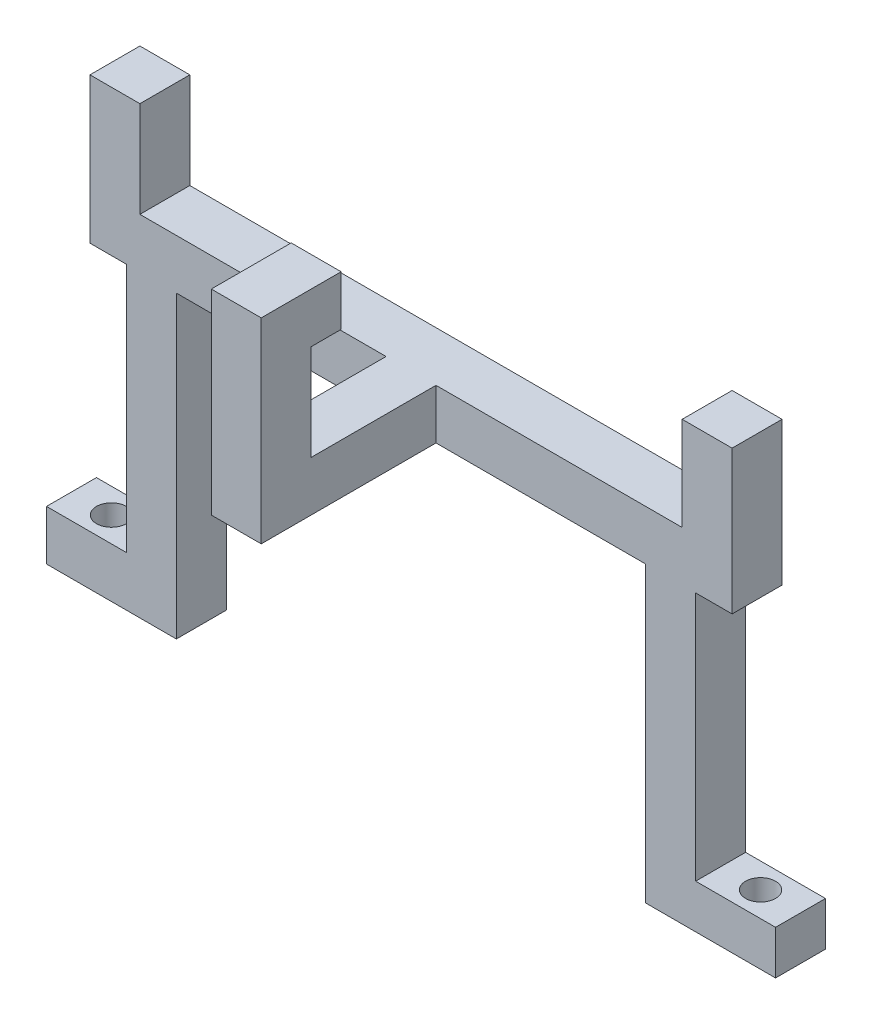
ISO-10303-21;
HEADER;
FILE_DESCRIPTION(('STEP AP214'),'2;1');
FILE_NAME('part.step','',(''),(''),'','','');
FILE_SCHEMA(('AUTOMOTIVE_DESIGN { 1 0 10303 214 1 1 1 1 }'));
ENDSEC;
DATA;
#1=APPLICATION_CONTEXT('core data for automotive mechanical design processes');
#2=APPLICATION_PROTOCOL_DEFINITION('international standard','automotive_design',2000,#1);
#3=PRODUCT_CONTEXT('',#1,'mechanical');
#4=PRODUCT('Part','Part','',(#3));
#5=PRODUCT_RELATED_PRODUCT_CATEGORY('part','',(#4));
#6=PRODUCT_DEFINITION_FORMATION('','',#4);
#7=PRODUCT_DEFINITION_CONTEXT('part definition',#1,'design');
#8=PRODUCT_DEFINITION('design','',#6,#7);
#9=PRODUCT_DEFINITION_SHAPE('','',#8);
#10=(LENGTH_UNIT() NAMED_UNIT(*) SI_UNIT(.MILLI.,.METRE.));
#11=(NAMED_UNIT(*) PLANE_ANGLE_UNIT() SI_UNIT($,.RADIAN.));
#12=(NAMED_UNIT(*) SI_UNIT($,.STERADIAN.) SOLID_ANGLE_UNIT());
#13=UNCERTAINTY_MEASURE_WITH_UNIT(LENGTH_MEASURE(1.E-05),#10,'distance_accuracy_value','');
#14=(GEOMETRIC_REPRESENTATION_CONTEXT(3) GLOBAL_UNCERTAINTY_ASSIGNED_CONTEXT((#13)) GLOBAL_UNIT_ASSIGNED_CONTEXT((#10,
#11,#12)) REPRESENTATION_CONTEXT('',''));
#15=CARTESIAN_POINT('',(0.,0.,0.));
#16=DIRECTION('',(0.,0.,1.));
#17=DIRECTION('',(1.,0.,0.));
#18=AXIS2_PLACEMENT_3D('',#15,#16,#17);
#19=CARTESIAN_POINT('',(0.,0.,5.));
#20=DIRECTION('',(0.,0.,1.));
#21=DIRECTION('',(1.,0.,0.));
#22=AXIS2_PLACEMENT_3D('',#19,#20,#21);
#23=PLANE('',#22);
#24=DIRECTION('',(0.,-1.,0.));
#25=VECTOR('',#24,1.);
#26=CARTESIAN_POINT('',(26.,25.,5.));
#27=LINE('',#26,#25);
#28=CARTESIAN_POINT('',(26.,30.,5.));
#29=VERTEX_POINT('',#28);
#30=CARTESIAN_POINT('',(26.,25.,5.));
#31=VERTEX_POINT('',#30);
#32=EDGE_CURVE('E56',#29,#31,#27,.T.);
#33=ORIENTED_EDGE('',*,*,#32,.F.);
#34=DIRECTION('',(-1.,0.,0.));
#35=VECTOR('',#34,1.);
#36=CARTESIAN_POINT('',(1.35,30.,5.));
#37=LINE('',#36,#35);
#38=CARTESIAN_POINT('',(1.35,30.,5.));
#39=VERTEX_POINT('',#38);
#40=EDGE_CURVE('E402',#29,#39,#37,.T.);
#41=ORIENTED_EDGE('',*,*,#40,.T.);
#42=DIRECTION('',(0.,1.,0.));
#43=VECTOR('',#42,1.);
#44=CARTESIAN_POINT('',(1.35,39.6,5.));
#45=LINE('',#44,#43);
#46=CARTESIAN_POINT('',(1.35,39.6,5.));
#47=VERTEX_POINT('',#46);
#48=EDGE_CURVE('E405',#39,#47,#45,.T.);
#49=ORIENTED_EDGE('',*,*,#48,.T.);
#50=DIRECTION('',(-1.,0.,0.));
#51=VECTOR('',#50,1.);
#52=CARTESIAN_POINT('',(-3.65,39.6,5.));
#53=LINE('',#52,#51);
#54=CARTESIAN_POINT('',(-3.65,39.6,5.));
#55=VERTEX_POINT('',#54);
#56=EDGE_CURVE('E407',#47,#55,#53,.T.);
#57=ORIENTED_EDGE('',*,*,#56,.T.);
#58=DIRECTION('',(0.,-1.,0.));
#59=VECTOR('',#58,1.);
#60=CARTESIAN_POINT('',(-3.65,25.,5.));
#61=LINE('',#60,#59);
#62=CARTESIAN_POINT('',(-3.65,25.,5.));
#63=VERTEX_POINT('',#62);
#64=EDGE_CURVE('E409',#55,#63,#61,.T.);
#65=ORIENTED_EDGE('',*,*,#64,.T.);
#66=DIRECTION('',(1.,0.,0.));
#67=VECTOR('',#66,1.);
#68=CARTESIAN_POINT('',(0.,25.,5.));
#69=LINE('',#68,#67);
#70=CARTESIAN_POINT('',(0.,25.,5.));
#71=VERTEX_POINT('',#70);
#72=EDGE_CURVE('E411',#63,#71,#69,.T.);
#73=ORIENTED_EDGE('',*,*,#72,.T.);
#74=DIRECTION('',(0.,-1.,0.));
#75=VECTOR('',#74,1.);
#76=CARTESIAN_POINT('',(0.,0.,5.));
#77=LINE('',#76,#75);
#78=CARTESIAN_POINT('',(0.,0.,5.));
#79=VERTEX_POINT('',#78);
#80=EDGE_CURVE('E413',#71,#79,#77,.T.);
#81=ORIENTED_EDGE('',*,*,#80,.T.);
#82=DIRECTION('',(-1.,0.,0.));
#83=VECTOR('',#82,1.);
#84=CARTESIAN_POINT('',(-8.,0.,5.));
#85=LINE('',#84,#83);
#86=CARTESIAN_POINT('',(-8.,0.,5.));
#87=VERTEX_POINT('',#86);
#88=EDGE_CURVE('E392',#79,#87,#85,.T.);
#89=ORIENTED_EDGE('',*,*,#88,.T.);
#90=DIRECTION('',(0.,-1.,0.));
#91=VECTOR('',#90,1.);
#92=CARTESIAN_POINT('',(-8.,-5.,5.));
#93=LINE('',#92,#91);
#94=CARTESIAN_POINT('',(-8.,-5.,5.));
#95=VERTEX_POINT('',#94);
#96=EDGE_CURVE('E395',#87,#95,#93,.T.);
#97=ORIENTED_EDGE('',*,*,#96,.T.);
#98=DIRECTION('',(1.,0.,0.));
#99=VECTOR('',#98,1.);
#100=CARTESIAN_POINT('',(5.00000000000001,-5.,5.));
#101=LINE('',#100,#99);
#102=CARTESIAN_POINT('',(5.00000000000001,-5.,5.));
#103=VERTEX_POINT('',#102);
#104=EDGE_CURVE('E398',#95,#103,#101,.T.);
#105=ORIENTED_EDGE('',*,*,#104,.T.);
#106=DIRECTION('',(0.,1.,0.));
#107=VECTOR('',#106,1.);
#108=CARTESIAN_POINT('',(5.,30.,5.));
#109=LINE('',#108,#107);
#110=CARTESIAN_POINT('',(5.,25.,5.));
#111=VERTEX_POINT('',#110);
#112=EDGE_CURVE('E400',#103,#111,#109,.T.);
#113=ORIENTED_EDGE('',*,*,#112,.T.);
#114=DIRECTION('',(-1.,0.,0.));
#115=VECTOR('',#114,1.);
#116=CARTESIAN_POINT('',(52.,25.,5.));
#117=LINE('',#116,#115);
#118=EDGE_CURVE('E61',#31,#111,#117,.T.);
#119=ORIENTED_EDGE('',*,*,#118,.F.);
#120=EDGE_LOOP('',(#33,#41,#49,#57,#65,#73,#81,#89,#97,#105,#113,#119));
#121=FACE_BOUND('',#120,.T.);
#122=ADVANCED_FACE('F41',(#121),#23,.T.);
#123=CARTESIAN_POINT('',(5.,30.,5.));
#124=DIRECTION('',(-1.,0.,0.));
#125=DIRECTION('',(0.,-1.,0.));
#126=AXIS2_PLACEMENT_3D('',#123,#124,#125);
#127=PLANE('',#126);
#128=DIRECTION('',(0.,0.,-1.));
#129=VECTOR('',#128,1.);
#130=CARTESIAN_POINT('',(5.,25.,5.));
#131=LINE('',#130,#129);
#132=CARTESIAN_POINT('',(5.,25.,0.));
#133=VERTEX_POINT('',#132);
#134=EDGE_CURVE('E357',#111,#133,#131,.T.);
#135=ORIENTED_EDGE('',*,*,#134,.F.);
#136=ORIENTED_EDGE('',*,*,#112,.F.);
#137=DIRECTION('',(0.,0.,-1.));
#138=VECTOR('',#137,1.);
#139=CARTESIAN_POINT('',(5.00000000000001,-5.,5.));
#140=LINE('',#139,#138);
#141=CARTESIAN_POINT('',(5.00000000000001,-5.,0.));
#142=VERTEX_POINT('',#141);
#143=EDGE_CURVE('E452',#103,#142,#140,.T.);
#144=ORIENTED_EDGE('',*,*,#143,.T.);
#145=DIRECTION('',(0.,1.,0.));
#146=VECTOR('',#145,1.);
#147=CARTESIAN_POINT('',(5.,30.,0.));
#148=LINE('',#147,#146);
#149=EDGE_CURVE('E422',#142,#133,#148,.T.);
#150=ORIENTED_EDGE('',*,*,#149,.T.);
#151=EDGE_LOOP('',(#135,#136,#144,#150));
#152=FACE_BOUND('',#151,.T.);
#153=ADVANCED_FACE('F468',(#152),#127,.F.);
#154=CARTESIAN_POINT('',(-8.,0.,5.));
#155=DIRECTION('',(0.,-1.,0.));
#156=DIRECTION('',(0.,0.,-1.));
#157=AXIS2_PLACEMENT_3D('',#154,#155,#156);
#158=PLANE('',#157);
#159=CARTESIAN_POINT('',(-4.,0.,2.5));
#160=DIRECTION('',(0.,1.,0.));
#161=DIRECTION('',(0.,0.,1.));
#162=AXIS2_PLACEMENT_3D('',#159,#160,#161);
#163=CIRCLE('',#162,1.5);
#164=CARTESIAN_POINT('',(-4.,0.,4.));
#165=VERTEX_POINT('',#164);
#166=EDGE_CURVE('E385',#165,#165,#163,.T.);
#167=ORIENTED_EDGE('',*,*,#166,.F.);
#168=EDGE_LOOP('',(#167));
#169=FACE_BOUND('',#168,.T.);
#170=DIRECTION('',(-1.,0.,0.));
#171=VECTOR('',#170,1.);
#172=CARTESIAN_POINT('',(-8.,0.,0.));
#173=LINE('',#172,#171);
#174=CARTESIAN_POINT('',(0.,0.,0.));
#175=VERTEX_POINT('',#174);
#176=CARTESIAN_POINT('',(-8.,0.,0.));
#177=VERTEX_POINT('',#176);
#178=EDGE_CURVE('E389',#175,#177,#173,.T.);
#179=ORIENTED_EDGE('',*,*,#178,.T.);
#180=DIRECTION('',(0.,0.,-1.));
#181=VECTOR('',#180,1.);
#182=CARTESIAN_POINT('',(-8.,0.,5.));
#183=LINE('',#182,#181);
#184=EDGE_CURVE('E11',#87,#177,#183,.T.);
#185=ORIENTED_EDGE('',*,*,#184,.F.);
#186=ORIENTED_EDGE('',*,*,#88,.F.);
#187=DIRECTION('',(0.,0.,-1.));
#188=VECTOR('',#187,1.);
#189=CARTESIAN_POINT('',(0.,0.,5.));
#190=LINE('',#189,#188);
#191=EDGE_CURVE('E415',#79,#175,#190,.T.);
#192=ORIENTED_EDGE('',*,*,#191,.T.);
#193=EDGE_LOOP('',(#179,#185,#186,#192));
#194=FACE_BOUND('',#193,.T.);
#195=ADVANCED_FACE('F43',(#169,#194),#158,.F.);
#196=CARTESIAN_POINT('',(-8.,-5.,5.));
#197=DIRECTION('',(1.,0.,0.));
#198=DIRECTION('',(0.,0.,-1.));
#199=AXIS2_PLACEMENT_3D('',#196,#197,#198);
#200=PLANE('',#199);
#201=DIRECTION('',(0.,-1.,0.));
#202=VECTOR('',#201,1.);
#203=CARTESIAN_POINT('',(-8.,-5.,0.));
#204=LINE('',#203,#202);
#205=CARTESIAN_POINT('',(-8.,-5.,0.));
#206=VERTEX_POINT('',#205);
#207=EDGE_CURVE('E418',#177,#206,#204,.T.);
#208=ORIENTED_EDGE('',*,*,#207,.T.);
#209=DIRECTION('',(0.,0.,-1.));
#210=VECTOR('',#209,1.);
#211=CARTESIAN_POINT('',(-8.,-5.,5.));
#212=LINE('',#211,#210);
#213=EDGE_CURVE('E49',#95,#206,#212,.T.);
#214=ORIENTED_EDGE('',*,*,#213,.F.);
#215=ORIENTED_EDGE('',*,*,#96,.F.);
#216=ORIENTED_EDGE('',*,*,#184,.T.);
#217=EDGE_LOOP('',(#208,#214,#215,#216));
#218=FACE_BOUND('',#217,.T.);
#219=ADVANCED_FACE('F518',(#218),#200,.F.);
#220=CARTESIAN_POINT('',(5.00000000000001,-5.,5.));
#221=DIRECTION('',(0.,1.,0.));
#222=DIRECTION('',(-1.,0.,0.));
#223=AXIS2_PLACEMENT_3D('',#220,#221,#222);
#224=PLANE('',#223);
#225=CARTESIAN_POINT('',(-4.,-5.,2.5));
#226=DIRECTION('',(0.,1.,0.));
#227=DIRECTION('',(0.,0.,1.));
#228=AXIS2_PLACEMENT_3D('',#225,#226,#227);
#229=CIRCLE('',#228,1.5);
#230=CARTESIAN_POINT('',(-4.,-5.,4.));
#231=VERTEX_POINT('',#230);
#232=EDGE_CURVE('E386',#231,#231,#229,.T.);
#233=ORIENTED_EDGE('',*,*,#232,.T.);
#234=EDGE_LOOP('',(#233));
#235=FACE_BOUND('',#234,.T.);
#236=DIRECTION('',(1.,0.,0.));
#237=VECTOR('',#236,1.);
#238=CARTESIAN_POINT('',(5.00000000000001,-5.,0.));
#239=LINE('',#238,#237);
#240=EDGE_CURVE('E420',#206,#142,#239,.T.);
#241=ORIENTED_EDGE('',*,*,#240,.T.);
#242=ORIENTED_EDGE('',*,*,#143,.F.);
#243=ORIENTED_EDGE('',*,*,#104,.F.);
#244=ORIENTED_EDGE('',*,*,#213,.T.);
#245=EDGE_LOOP('',(#241,#242,#243,#244));
#246=FACE_BOUND('',#245,.T.);
#247=ADVANCED_FACE('F459',(#235,#246),#224,.F.);
#248=CARTESIAN_POINT('',(1.35,30.,5.));
#249=DIRECTION('',(0.,-1.,0.));
#250=DIRECTION('',(0.,0.,-1.));
#251=AXIS2_PLACEMENT_3D('',#248,#249,#250);
#252=PLANE('',#251);
#253=DIRECTION('',(-1.,0.,0.));
#254=VECTOR('',#253,1.);
#255=CARTESIAN_POINT('',(1.35,30.,0.));
#256=LINE('',#255,#254);
#257=CARTESIAN_POINT('',(55.65,30.,0.));
#258=VERTEX_POINT('',#257);
#259=CARTESIAN_POINT('',(1.35,30.,0.));
#260=VERTEX_POINT('',#259);
#261=EDGE_CURVE('E424',#258,#260,#256,.T.);
#262=ORIENTED_EDGE('',*,*,#261,.T.);
#263=DIRECTION('',(0.,0.,-1.));
#264=VECTOR('',#263,1.);
#265=CARTESIAN_POINT('',(1.35,30.,5.));
#266=LINE('',#265,#264);
#267=EDGE_CURVE('E449',#39,#260,#266,.T.);
#268=ORIENTED_EDGE('',*,*,#267,.F.);
#269=ORIENTED_EDGE('',*,*,#40,.F.);
#270=DIRECTION('',(0.,0.,-1.));
#271=VECTOR('',#270,1.);
#272=CARTESIAN_POINT('',(26.,30.,17.5));
#273=LINE('',#272,#271);
#274=CARTESIAN_POINT('',(26.,30.,17.5));
#275=VERTEX_POINT('',#274);
#276=EDGE_CURVE('E291',#275,#29,#273,.T.);
#277=ORIENTED_EDGE('',*,*,#276,.F.);
#278=DIRECTION('',(-1.,0.,0.));
#279=VECTOR('',#278,1.);
#280=CARTESIAN_POINT('',(26.,30.,17.5));
#281=LINE('',#280,#279);
#282=CARTESIAN_POINT('',(31.,30.,17.5));
#283=VERTEX_POINT('',#282);
#284=EDGE_CURVE('E277',#283,#275,#281,.T.);
#285=ORIENTED_EDGE('',*,*,#284,.F.);
#286=DIRECTION('',(0.,0.,-1.));
#287=VECTOR('',#286,1.);
#288=CARTESIAN_POINT('',(31.,30.,17.5));
#289=LINE('',#288,#287);
#290=CARTESIAN_POINT('',(31.,30.,5.));
#291=VERTEX_POINT('',#290);
#292=EDGE_CURVE('E280',#283,#291,#289,.T.);
#293=ORIENTED_EDGE('',*,*,#292,.T.);
#294=CARTESIAN_POINT('',(55.65,30.,5.));
#295=VERTEX_POINT('',#294);
#296=EDGE_CURVE('E403',#295,#291,#37,.T.);
#297=ORIENTED_EDGE('',*,*,#296,.F.);
#298=DIRECTION('',(0.,0.,-1.));
#299=VECTOR('',#298,1.);
#300=CARTESIAN_POINT('',(55.65,30.,5.));
#301=LINE('',#300,#299);
#302=EDGE_CURVE('E329',#295,#258,#301,.T.);
#303=ORIENTED_EDGE('',*,*,#302,.T.);
#304=EDGE_LOOP('',(#262,#268,#269,#277,#285,#293,#297,#303));
#305=FACE_BOUND('',#304,.T.);
#306=ADVANCED_FACE('F487',(#305),#252,.F.);
#307=CARTESIAN_POINT('',(1.35,39.6,5.));
#308=DIRECTION('',(-1.,0.,0.));
#309=DIRECTION('',(0.,-1.,0.));
#310=AXIS2_PLACEMENT_3D('',#307,#308,#309);
#311=PLANE('',#310);
#312=DIRECTION('',(0.,1.,0.));
#313=VECTOR('',#312,1.);
#314=CARTESIAN_POINT('',(1.35,39.6,0.));
#315=LINE('',#314,#313);
#316=CARTESIAN_POINT('',(1.35,39.6,0.));
#317=VERTEX_POINT('',#316);
#318=EDGE_CURVE('E426',#260,#317,#315,.T.);
#319=ORIENTED_EDGE('',*,*,#318,.T.);
#320=DIRECTION('',(0.,0.,-1.));
#321=VECTOR('',#320,1.);
#322=CARTESIAN_POINT('',(1.35,39.6,5.));
#323=LINE('',#322,#321);
#324=EDGE_CURVE('E446',#47,#317,#323,.T.);
#325=ORIENTED_EDGE('',*,*,#324,.F.);
#326=ORIENTED_EDGE('',*,*,#48,.F.);
#327=ORIENTED_EDGE('',*,*,#267,.T.);
#328=EDGE_LOOP('',(#319,#325,#326,#327));
#329=FACE_BOUND('',#328,.T.);
#330=ADVANCED_FACE('F495',(#329),#311,.F.);
#331=CARTESIAN_POINT('',(-3.65,39.6,5.));
#332=DIRECTION('',(0.,-1.,0.));
#333=DIRECTION('',(0.,0.,-1.));
#334=AXIS2_PLACEMENT_3D('',#331,#332,#333);
#335=PLANE('',#334);
#336=DIRECTION('',(-1.,0.,0.));
#337=VECTOR('',#336,1.);
#338=CARTESIAN_POINT('',(-3.65,39.6,0.));
#339=LINE('',#338,#337);
#340=CARTESIAN_POINT('',(-3.65,39.6,0.));
#341=VERTEX_POINT('',#340);
#342=EDGE_CURVE('E428',#317,#341,#339,.T.);
#343=ORIENTED_EDGE('',*,*,#342,.T.);
#344=DIRECTION('',(0.,0.,-1.));
#345=VECTOR('',#344,1.);
#346=CARTESIAN_POINT('',(-3.65,39.6,5.));
#347=LINE('',#346,#345);
#348=EDGE_CURVE('E443',#55,#341,#347,.T.);
#349=ORIENTED_EDGE('',*,*,#348,.F.);
#350=ORIENTED_EDGE('',*,*,#56,.F.);
#351=ORIENTED_EDGE('',*,*,#324,.T.);
#352=EDGE_LOOP('',(#343,#349,#350,#351));
#353=FACE_BOUND('',#352,.T.);
#354=ADVANCED_FACE('F499',(#353),#335,.F.);
#355=CARTESIAN_POINT('',(-3.65,25.,5.));
#356=DIRECTION('',(1.,0.,0.));
#357=DIRECTION('',(0.,0.,-1.));
#358=AXIS2_PLACEMENT_3D('',#355,#356,#357);
#359=PLANE('',#358);
#360=DIRECTION('',(0.,-1.,0.));
#361=VECTOR('',#360,1.);
#362=CARTESIAN_POINT('',(-3.65,25.,0.));
#363=LINE('',#362,#361);
#364=CARTESIAN_POINT('',(-3.65,25.,0.));
#365=VERTEX_POINT('',#364);
#366=EDGE_CURVE('E430',#341,#365,#363,.T.);
#367=ORIENTED_EDGE('',*,*,#366,.T.);
#368=DIRECTION('',(0.,0.,-1.));
#369=VECTOR('',#368,1.);
#370=CARTESIAN_POINT('',(-3.65,25.,5.));
#371=LINE('',#370,#369);
#372=EDGE_CURVE('E440',#63,#365,#371,.T.);
#373=ORIENTED_EDGE('',*,*,#372,.F.);
#374=ORIENTED_EDGE('',*,*,#64,.F.);
#375=ORIENTED_EDGE('',*,*,#348,.T.);
#376=EDGE_LOOP('',(#367,#373,#374,#375));
#377=FACE_BOUND('',#376,.T.);
#378=ADVANCED_FACE('F504',(#377),#359,.F.);
#379=CARTESIAN_POINT('',(0.,25.,5.));
#380=DIRECTION('',(0.,1.,0.));
#381=DIRECTION('',(0.,0.,1.));
#382=AXIS2_PLACEMENT_3D('',#379,#380,#381);
#383=PLANE('',#382);
#384=DIRECTION('',(1.,0.,0.));
#385=VECTOR('',#384,1.);
#386=CARTESIAN_POINT('',(0.,25.,0.));
#387=LINE('',#386,#385);
#388=CARTESIAN_POINT('',(0.,25.,0.));
#389=VERTEX_POINT('',#388);
#390=EDGE_CURVE('E432',#365,#389,#387,.T.);
#391=ORIENTED_EDGE('',*,*,#390,.T.);
#392=DIRECTION('',(0.,0.,-1.));
#393=VECTOR('',#392,1.);
#394=CARTESIAN_POINT('',(0.,25.,5.));
#395=LINE('',#394,#393);
#396=EDGE_CURVE('E437',#71,#389,#395,.T.);
#397=ORIENTED_EDGE('',*,*,#396,.F.);
#398=ORIENTED_EDGE('',*,*,#72,.F.);
#399=ORIENTED_EDGE('',*,*,#372,.T.);
#400=EDGE_LOOP('',(#391,#397,#398,#399));
#401=FACE_BOUND('',#400,.T.);
#402=ADVANCED_FACE('F510',(#401),#383,.F.);
#403=CARTESIAN_POINT('',(0.,0.,5.));
#404=DIRECTION('',(1.,0.,0.));
#405=DIRECTION('',(0.,0.,-1.));
#406=AXIS2_PLACEMENT_3D('',#403,#404,#405);
#407=PLANE('',#406);
#408=DIRECTION('',(0.,-1.,0.));
#409=VECTOR('',#408,1.);
#410=CARTESIAN_POINT('',(0.,0.,0.));
#411=LINE('',#410,#409);
#412=EDGE_CURVE('E396',#389,#175,#411,.T.);
#413=ORIENTED_EDGE('',*,*,#412,.T.);
#414=ORIENTED_EDGE('',*,*,#191,.F.);
#415=ORIENTED_EDGE('',*,*,#80,.F.);
#416=ORIENTED_EDGE('',*,*,#396,.T.);
#417=EDGE_LOOP('',(#413,#414,#415,#416));
#418=FACE_BOUND('',#417,.T.);
#419=ADVANCED_FACE('F514',(#418),#407,.F.);
#420=DIRECTION('',(0.,1.,0.));
#421=VECTOR('',#420,1.);
#422=CARTESIAN_POINT('',(31.,30.,5.));
#423=LINE('',#422,#421);
#424=CARTESIAN_POINT('',(31.,25.,5.));
#425=VERTEX_POINT('',#424);
#426=EDGE_CURVE('E281',#425,#291,#423,.T.);
#427=ORIENTED_EDGE('',*,*,#426,.F.);
#428=CARTESIAN_POINT('',(52.,25.,5.));
#429=VERTEX_POINT('',#428);
#430=EDGE_CURVE('E382',#429,#425,#117,.T.);
#431=ORIENTED_EDGE('',*,*,#430,.F.);
#432=DIRECTION('',(0.,1.,0.));
#433=VECTOR('',#432,1.);
#434=CARTESIAN_POINT('',(52.,25.,5.));
#435=LINE('',#434,#433);
#436=CARTESIAN_POINT('',(52.,-4.39588753399231,5.));
#437=VERTEX_POINT('',#436);
#438=EDGE_CURVE('E301',#437,#429,#435,.T.);
#439=ORIENTED_EDGE('',*,*,#438,.F.);
#440=DIRECTION('',(-1.,0.,0.));
#441=VECTOR('',#440,1.);
#442=CARTESIAN_POINT('',(65.,-4.39588753399231,5.));
#443=LINE('',#442,#441);
#444=CARTESIAN_POINT('',(65.,-4.39588753399231,5.));
#445=VERTEX_POINT('',#444);
#446=EDGE_CURVE('E326',#445,#437,#443,.T.);
#447=ORIENTED_EDGE('',*,*,#446,.F.);
#448=DIRECTION('',(0.,-1.,0.));
#449=VECTOR('',#448,1.);
#450=CARTESIAN_POINT('',(65.,0.,5.));
#451=LINE('',#450,#449);
#452=CARTESIAN_POINT('',(65.,0.,5.));
#453=VERTEX_POINT('',#452);
#454=EDGE_CURVE('E323',#453,#445,#451,.T.);
#455=ORIENTED_EDGE('',*,*,#454,.F.);
#456=DIRECTION('',(1.,0.,0.));
#457=VECTOR('',#456,1.);
#458=CARTESIAN_POINT('',(57.,0.,5.));
#459=LINE('',#458,#457);
#460=CARTESIAN_POINT('',(57.,0.,5.));
#461=VERTEX_POINT('',#460);
#462=EDGE_CURVE('E320',#461,#453,#459,.T.);
#463=ORIENTED_EDGE('',*,*,#462,.F.);
#464=DIRECTION('',(0.,-1.,0.));
#465=VECTOR('',#464,1.);
#466=CARTESIAN_POINT('',(57.,25.,5.));
#467=LINE('',#466,#465);
#468=CARTESIAN_POINT('',(57.,25.,5.));
#469=VERTEX_POINT('',#468);
#470=EDGE_CURVE('E317',#469,#461,#467,.T.);
#471=ORIENTED_EDGE('',*,*,#470,.F.);
#472=DIRECTION('',(-1.,0.,0.));
#473=VECTOR('',#472,1.);
#474=CARTESIAN_POINT('',(60.65,25.,5.));
#475=LINE('',#474,#473);
#476=CARTESIAN_POINT('',(60.65,25.,5.));
#477=VERTEX_POINT('',#476);
#478=EDGE_CURVE('E314',#477,#469,#475,.T.);
#479=ORIENTED_EDGE('',*,*,#478,.F.);
#480=DIRECTION('',(0.,-1.,0.));
#481=VECTOR('',#480,1.);
#482=CARTESIAN_POINT('',(60.65,39.3793200088199,5.));
#483=LINE('',#482,#481);
#484=CARTESIAN_POINT('',(60.65,39.3793200088199,5.));
#485=VERTEX_POINT('',#484);
#486=EDGE_CURVE('E311',#485,#477,#483,.T.);
#487=ORIENTED_EDGE('',*,*,#486,.F.);
#488=DIRECTION('',(1.,0.,0.));
#489=VECTOR('',#488,1.);
#490=CARTESIAN_POINT('',(55.65,39.3793200088199,5.));
#491=LINE('',#490,#489);
#492=CARTESIAN_POINT('',(55.65,39.3793200088199,5.));
#493=VERTEX_POINT('',#492);
#494=EDGE_CURVE('E308',#493,#485,#491,.T.);
#495=ORIENTED_EDGE('',*,*,#494,.F.);
#496=DIRECTION('',(0.,1.,0.));
#497=VECTOR('',#496,1.);
#498=CARTESIAN_POINT('',(55.65,30.,5.));
#499=LINE('',#498,#497);
#500=EDGE_CURVE('E304',#295,#493,#499,.T.);
#501=ORIENTED_EDGE('',*,*,#500,.F.);
#502=ORIENTED_EDGE('',*,*,#296,.T.);
#503=EDGE_LOOP('',(#427,#431,#439,#447,#455,#463,#471,#479,#487,#495,#501,#502));
#504=FACE_BOUND('',#503,.T.);
#505=ADVANCED_FACE('F557',(#504),#23,.T.);
#506=CARTESIAN_POINT('',(0.,0.,0.));
#507=DIRECTION('',(0.,0.,1.));
#508=DIRECTION('',(1.,0.,0.));
#509=AXIS2_PLACEMENT_3D('',#506,#507,#508);
#510=PLANE('',#509);
#511=ORIENTED_EDGE('',*,*,#178,.F.);
#512=ORIENTED_EDGE('',*,*,#412,.F.);
#513=ORIENTED_EDGE('',*,*,#390,.F.);
#514=ORIENTED_EDGE('',*,*,#366,.F.);
#515=ORIENTED_EDGE('',*,*,#342,.F.);
#516=ORIENTED_EDGE('',*,*,#318,.F.);
#517=ORIENTED_EDGE('',*,*,#261,.F.);
#518=DIRECTION('',(0.,1.,0.));
#519=VECTOR('',#518,1.);
#520=CARTESIAN_POINT('',(55.65,30.,0.));
#521=LINE('',#520,#519);
#522=CARTESIAN_POINT('',(55.65,39.3793200088199,0.));
#523=VERTEX_POINT('',#522);
#524=EDGE_CURVE('E300',#258,#523,#521,.T.);
#525=ORIENTED_EDGE('',*,*,#524,.T.);
#526=DIRECTION('',(1.,0.,0.));
#527=VECTOR('',#526,1.);
#528=CARTESIAN_POINT('',(55.65,39.3793200088199,0.));
#529=LINE('',#528,#527);
#530=CARTESIAN_POINT('',(60.65,39.3793200088199,0.));
#531=VERTEX_POINT('',#530);
#532=EDGE_CURVE('E332',#523,#531,#529,.T.);
#533=ORIENTED_EDGE('',*,*,#532,.T.);
#534=DIRECTION('',(0.,-1.,0.));
#535=VECTOR('',#534,1.);
#536=CARTESIAN_POINT('',(60.65,39.3793200088199,0.));
#537=LINE('',#536,#535);
#538=CARTESIAN_POINT('',(60.65,25.,0.));
#539=VERTEX_POINT('',#538);
#540=EDGE_CURVE('E335',#531,#539,#537,.T.);
#541=ORIENTED_EDGE('',*,*,#540,.T.);
#542=DIRECTION('',(-1.,0.,0.));
#543=VECTOR('',#542,1.);
#544=CARTESIAN_POINT('',(60.65,25.,0.));
#545=LINE('',#544,#543);
#546=CARTESIAN_POINT('',(57.,25.,0.));
#547=VERTEX_POINT('',#546);
#548=EDGE_CURVE('E338',#539,#547,#545,.T.);
#549=ORIENTED_EDGE('',*,*,#548,.T.);
#550=DIRECTION('',(0.,-1.,0.));
#551=VECTOR('',#550,1.);
#552=CARTESIAN_POINT('',(57.,25.,0.));
#553=LINE('',#552,#551);
#554=CARTESIAN_POINT('',(57.,0.,0.));
#555=VERTEX_POINT('',#554);
#556=EDGE_CURVE('E341',#547,#555,#553,.T.);
#557=ORIENTED_EDGE('',*,*,#556,.T.);
#558=DIRECTION('',(1.,0.,0.));
#559=VECTOR('',#558,1.);
#560=CARTESIAN_POINT('',(57.,0.,0.));
#561=LINE('',#560,#559);
#562=CARTESIAN_POINT('',(65.,0.,0.));
#563=VERTEX_POINT('',#562);
#564=EDGE_CURVE('E344',#555,#563,#561,.T.);
#565=ORIENTED_EDGE('',*,*,#564,.T.);
#566=DIRECTION('',(0.,-1.,0.));
#567=VECTOR('',#566,1.);
#568=CARTESIAN_POINT('',(65.,0.,0.));
#569=LINE('',#568,#567);
#570=CARTESIAN_POINT('',(65.,-4.39588753399231,0.));
#571=VERTEX_POINT('',#570);
#572=EDGE_CURVE('E347',#563,#571,#569,.T.);
#573=ORIENTED_EDGE('',*,*,#572,.T.);
#574=DIRECTION('',(-1.,0.,0.));
#575=VECTOR('',#574,1.);
#576=CARTESIAN_POINT('',(65.,-4.39588753399231,0.));
#577=LINE('',#576,#575);
#578=CARTESIAN_POINT('',(52.,-4.39588753399231,0.));
#579=VERTEX_POINT('',#578);
#580=EDGE_CURVE('E350',#571,#579,#577,.T.);
#581=ORIENTED_EDGE('',*,*,#580,.T.);
#582=DIRECTION('',(0.,1.,0.));
#583=VECTOR('',#582,1.);
#584=CARTESIAN_POINT('',(52.,-4.39588753399231,0.));
#585=LINE('',#584,#583);
#586=CARTESIAN_POINT('',(52.,25.,0.));
#587=VERTEX_POINT('',#586);
#588=EDGE_CURVE('E305',#579,#587,#585,.T.);
#589=ORIENTED_EDGE('',*,*,#588,.T.);
#590=DIRECTION('',(-1.,0.,0.));
#591=VECTOR('',#590,1.);
#592=CARTESIAN_POINT('',(52.,25.,0.));
#593=LINE('',#592,#591);
#594=EDGE_CURVE('E377',#587,#133,#593,.T.);
#595=ORIENTED_EDGE('',*,*,#594,.T.);
#596=ORIENTED_EDGE('',*,*,#149,.F.);
#597=ORIENTED_EDGE('',*,*,#240,.F.);
#598=ORIENTED_EDGE('',*,*,#207,.F.);
#599=EDGE_LOOP('',(#511,#512,#513,#514,#515,#516,#517,#525,#533,#541,#549,#557,#565,#573,#581,
#589,#595,#596,#597,#598));
#600=FACE_BOUND('',#599,.T.);
#601=ADVANCED_FACE('F465',(#600),#510,.F.);
#602=CARTESIAN_POINT('',(-4.,-5.,2.5));
#603=DIRECTION('',(0.,1.,0.));
#604=DIRECTION('',(0.,0.,1.));
#605=AXIS2_PLACEMENT_3D('',#602,#603,#604);
#606=CYLINDRICAL_SURFACE('',#605,1.5);
#607=ORIENTED_EDGE('',*,*,#232,.F.);
#608=EDGE_LOOP('',(#607));
#609=FACE_BOUND('',#608,.T.);
#610=ORIENTED_EDGE('',*,*,#166,.T.);
#611=EDGE_LOOP('',(#610));
#612=FACE_BOUND('',#611,.T.);
#613=ADVANCED_FACE('F565',(#609,#612),#606,.F.);
#614=CARTESIAN_POINT('',(52.,25.,5.));
#615=DIRECTION('',(0.,1.,0.));
#616=DIRECTION('',(-1.,0.,0.));
#617=AXIS2_PLACEMENT_3D('',#614,#615,#616);
#618=PLANE('',#617);
#619=ORIENTED_EDGE('',*,*,#134,.T.);
#620=ORIENTED_EDGE('',*,*,#594,.F.);
#621=DIRECTION('',(0.,0.,-1.));
#622=VECTOR('',#621,1.);
#623=CARTESIAN_POINT('',(52.,25.,5.));
#624=LINE('',#623,#622);
#625=EDGE_CURVE('E374',#429,#587,#624,.T.);
#626=ORIENTED_EDGE('',*,*,#625,.F.);
#627=ORIENTED_EDGE('',*,*,#430,.T.);
#628=DIRECTION('',(0.,0.,-1.));
#629=VECTOR('',#628,1.);
#630=CARTESIAN_POINT('',(31.,25.,17.5));
#631=LINE('',#630,#629);
#632=CARTESIAN_POINT('',(31.,25.,22.5));
#633=VERTEX_POINT('',#632);
#634=EDGE_CURVE('E287',#633,#425,#631,.T.);
#635=ORIENTED_EDGE('',*,*,#634,.F.);
#636=DIRECTION('',(-1.,0.,0.));
#637=VECTOR('',#636,1.);
#638=CARTESIAN_POINT('',(31.,25.,22.5));
#639=LINE('',#638,#637);
#640=CARTESIAN_POINT('',(26.,25.,22.5));
#641=VERTEX_POINT('',#640);
#642=EDGE_CURVE('E266',#633,#641,#639,.T.);
#643=ORIENTED_EDGE('',*,*,#642,.T.);
#644=DIRECTION('',(0.,0.,-1.));
#645=VECTOR('',#644,1.);
#646=CARTESIAN_POINT('',(26.,25.,17.5));
#647=LINE('',#646,#645);
#648=EDGE_CURVE('E231',#641,#31,#647,.T.);
#649=ORIENTED_EDGE('',*,*,#648,.T.);
#650=ORIENTED_EDGE('',*,*,#118,.T.);
#651=EDGE_LOOP('',(#619,#620,#626,#627,#635,#643,#649,#650));
#652=FACE_BOUND('',#651,.T.);
#653=ADVANCED_FACE('F471',(#652),#618,.F.);
#654=CARTESIAN_POINT('',(52.,-4.39588753399231,5.));
#655=DIRECTION('',(-1.,0.,0.));
#656=DIRECTION('',(0.,0.,1.));
#657=AXIS2_PLACEMENT_3D('',#654,#655,#656);
#658=PLANE('',#657);
#659=ORIENTED_EDGE('',*,*,#438,.T.);
#660=ORIENTED_EDGE('',*,*,#625,.T.);
#661=ORIENTED_EDGE('',*,*,#588,.F.);
#662=DIRECTION('',(0.,0.,-1.));
#663=VECTOR('',#662,1.);
#664=CARTESIAN_POINT('',(52.,-4.39588753399231,5.));
#665=LINE('',#664,#663);
#666=EDGE_CURVE('E355',#437,#579,#665,.T.);
#667=ORIENTED_EDGE('',*,*,#666,.F.);
#668=EDGE_LOOP('',(#659,#660,#661,#667));
#669=FACE_BOUND('',#668,.T.);
#670=ADVANCED_FACE('F555',(#669),#658,.T.);
#671=CARTESIAN_POINT('',(65.,-4.39588753399231,5.));
#672=DIRECTION('',(0.,-1.,0.));
#673=DIRECTION('',(0.,0.,-1.));
#674=AXIS2_PLACEMENT_3D('',#671,#672,#673);
#675=PLANE('',#674);
#676=CARTESIAN_POINT('',(61.,-4.39588753399231,2.5));
#677=DIRECTION('',(0.,-1.,0.));
#678=DIRECTION('',(0.,0.,-1.));
#679=AXIS2_PLACEMENT_3D('',#676,#677,#678);
#680=CIRCLE('',#679,1.5);
#681=CARTESIAN_POINT('',(61.,-4.39588753399231,1.));
#682=VERTEX_POINT('',#681);
#683=EDGE_CURVE('E297',#682,#682,#680,.T.);
#684=ORIENTED_EDGE('',*,*,#683,.F.);
#685=EDGE_LOOP('',(#684));
#686=FACE_BOUND('',#685,.T.);
#687=ORIENTED_EDGE('',*,*,#580,.F.);
#688=DIRECTION('',(0.,0.,-1.));
#689=VECTOR('',#688,1.);
#690=CARTESIAN_POINT('',(65.,-4.39588753399231,5.));
#691=LINE('',#690,#689);
#692=EDGE_CURVE('E358',#445,#571,#691,.T.);
#693=ORIENTED_EDGE('',*,*,#692,.F.);
#694=ORIENTED_EDGE('',*,*,#446,.T.);
#695=ORIENTED_EDGE('',*,*,#666,.T.);
#696=EDGE_LOOP('',(#687,#693,#694,#695));
#697=FACE_BOUND('',#696,.T.);
#698=ADVANCED_FACE('F551',(#686,#697),#675,.T.);
#699=CARTESIAN_POINT('',(65.,0.,5.));
#700=DIRECTION('',(1.,0.,0.));
#701=DIRECTION('',(0.,0.,-1.));
#702=AXIS2_PLACEMENT_3D('',#699,#700,#701);
#703=PLANE('',#702);
#704=ORIENTED_EDGE('',*,*,#572,.F.);
#705=DIRECTION('',(0.,0.,-1.));
#706=VECTOR('',#705,1.);
#707=CARTESIAN_POINT('',(65.,0.,5.));
#708=LINE('',#707,#706);
#709=EDGE_CURVE('E360',#453,#563,#708,.T.);
#710=ORIENTED_EDGE('',*,*,#709,.F.);
#711=ORIENTED_EDGE('',*,*,#454,.T.);
#712=ORIENTED_EDGE('',*,*,#692,.T.);
#713=EDGE_LOOP('',(#704,#710,#711,#712));
#714=FACE_BOUND('',#713,.T.);
#715=ADVANCED_FACE('F547',(#714),#703,.T.);
#716=CARTESIAN_POINT('',(57.,0.,5.));
#717=DIRECTION('',(0.,1.,0.));
#718=DIRECTION('',(-1.,0.,0.));
#719=AXIS2_PLACEMENT_3D('',#716,#717,#718);
#720=PLANE('',#719);
#721=CARTESIAN_POINT('',(61.,0.,2.5));
#722=DIRECTION('',(0.,1.,0.));
#723=DIRECTION('',(-1.,0.,0.));
#724=AXIS2_PLACEMENT_3D('',#721,#722,#723);
#725=CIRCLE('',#724,1.5);
#726=CARTESIAN_POINT('',(59.5,0.,2.5));
#727=VERTEX_POINT('',#726);
#728=EDGE_CURVE('E294',#727,#727,#725,.T.);
#729=ORIENTED_EDGE('',*,*,#728,.F.);
#730=EDGE_LOOP('',(#729));
#731=FACE_BOUND('',#730,.T.);
#732=ORIENTED_EDGE('',*,*,#564,.F.);
#733=DIRECTION('',(0.,0.,-1.));
#734=VECTOR('',#733,1.);
#735=CARTESIAN_POINT('',(57.,0.,5.));
#736=LINE('',#735,#734);
#737=EDGE_CURVE('E362',#461,#555,#736,.T.);
#738=ORIENTED_EDGE('',*,*,#737,.F.);
#739=ORIENTED_EDGE('',*,*,#462,.T.);
#740=ORIENTED_EDGE('',*,*,#709,.T.);
#741=EDGE_LOOP('',(#732,#738,#739,#740));
#742=FACE_BOUND('',#741,.T.);
#743=ADVANCED_FACE('F543',(#731,#742),#720,.T.);
#744=CARTESIAN_POINT('',(57.,25.,5.));
#745=DIRECTION('',(1.,0.,0.));
#746=DIRECTION('',(0.,0.,-1.));
#747=AXIS2_PLACEMENT_3D('',#744,#745,#746);
#748=PLANE('',#747);
#749=ORIENTED_EDGE('',*,*,#556,.F.);
#750=DIRECTION('',(0.,0.,-1.));
#751=VECTOR('',#750,1.);
#752=CARTESIAN_POINT('',(57.,25.,5.));
#753=LINE('',#752,#751);
#754=EDGE_CURVE('E364',#469,#547,#753,.T.);
#755=ORIENTED_EDGE('',*,*,#754,.F.);
#756=ORIENTED_EDGE('',*,*,#470,.T.);
#757=ORIENTED_EDGE('',*,*,#737,.T.);
#758=EDGE_LOOP('',(#749,#755,#756,#757));
#759=FACE_BOUND('',#758,.T.);
#760=ADVANCED_FACE('F539',(#759),#748,.T.);
#761=CARTESIAN_POINT('',(60.65,25.,5.));
#762=DIRECTION('',(0.,-1.,0.));
#763=DIRECTION('',(0.,0.,-1.));
#764=AXIS2_PLACEMENT_3D('',#761,#762,#763);
#765=PLANE('',#764);
#766=ORIENTED_EDGE('',*,*,#548,.F.);
#767=DIRECTION('',(0.,0.,-1.));
#768=VECTOR('',#767,1.);
#769=CARTESIAN_POINT('',(60.65,25.,5.));
#770=LINE('',#769,#768);
#771=EDGE_CURVE('E366',#477,#539,#770,.T.);
#772=ORIENTED_EDGE('',*,*,#771,.F.);
#773=ORIENTED_EDGE('',*,*,#478,.T.);
#774=ORIENTED_EDGE('',*,*,#754,.T.);
#775=EDGE_LOOP('',(#766,#772,#773,#774));
#776=FACE_BOUND('',#775,.T.);
#777=ADVANCED_FACE('F535',(#776),#765,.T.);
#778=CARTESIAN_POINT('',(60.65,39.3793200088199,5.));
#779=DIRECTION('',(1.,0.,0.));
#780=DIRECTION('',(0.,0.,-1.));
#781=AXIS2_PLACEMENT_3D('',#778,#779,#780);
#782=PLANE('',#781);
#783=ORIENTED_EDGE('',*,*,#540,.F.);
#784=DIRECTION('',(0.,0.,-1.));
#785=VECTOR('',#784,1.);
#786=CARTESIAN_POINT('',(60.65,39.3793200088199,5.));
#787=LINE('',#786,#785);
#788=EDGE_CURVE('E368',#485,#531,#787,.T.);
#789=ORIENTED_EDGE('',*,*,#788,.F.);
#790=ORIENTED_EDGE('',*,*,#486,.T.);
#791=ORIENTED_EDGE('',*,*,#771,.T.);
#792=EDGE_LOOP('',(#783,#789,#790,#791));
#793=FACE_BOUND('',#792,.T.);
#794=ADVANCED_FACE('F531',(#793),#782,.T.);
#795=CARTESIAN_POINT('',(55.65,39.3793200088199,5.));
#796=DIRECTION('',(0.,1.,0.));
#797=DIRECTION('',(0.,0.,1.));
#798=AXIS2_PLACEMENT_3D('',#795,#796,#797);
#799=PLANE('',#798);
#800=ORIENTED_EDGE('',*,*,#532,.F.);
#801=DIRECTION('',(0.,0.,-1.));
#802=VECTOR('',#801,1.);
#803=CARTESIAN_POINT('',(55.65,39.3793200088199,5.));
#804=LINE('',#803,#802);
#805=EDGE_CURVE('E370',#493,#523,#804,.T.);
#806=ORIENTED_EDGE('',*,*,#805,.F.);
#807=ORIENTED_EDGE('',*,*,#494,.T.);
#808=ORIENTED_EDGE('',*,*,#788,.T.);
#809=EDGE_LOOP('',(#800,#806,#807,#808));
#810=FACE_BOUND('',#809,.T.);
#811=ADVANCED_FACE('F527',(#810),#799,.T.);
#812=CARTESIAN_POINT('',(55.65,30.,5.));
#813=DIRECTION('',(-1.,0.,0.));
#814=DIRECTION('',(0.,0.,1.));
#815=AXIS2_PLACEMENT_3D('',#812,#813,#814);
#816=PLANE('',#815);
#817=ORIENTED_EDGE('',*,*,#524,.F.);
#818=ORIENTED_EDGE('',*,*,#302,.F.);
#819=ORIENTED_EDGE('',*,*,#500,.T.);
#820=ORIENTED_EDGE('',*,*,#805,.T.);
#821=EDGE_LOOP('',(#817,#818,#819,#820));
#822=FACE_BOUND('',#821,.T.);
#823=ADVANCED_FACE('F523',(#822),#816,.T.);
#824=CARTESIAN_POINT('',(61.,-5.00000000000001,2.5));
#825=DIRECTION('',(0.,1.,0.));
#826=DIRECTION('',(-1.,0.,0.));
#827=AXIS2_PLACEMENT_3D('',#824,#825,#826);
#828=CYLINDRICAL_SURFACE('',#827,1.5);
#829=ORIENTED_EDGE('',*,*,#683,.T.);
#830=EDGE_LOOP('',(#829));
#831=FACE_BOUND('',#830,.T.);
#832=ORIENTED_EDGE('',*,*,#728,.T.);
#833=EDGE_LOOP('',(#832));
#834=FACE_BOUND('',#833,.T.);
#835=ADVANCED_FACE('F699',(#831,#834),#828,.F.);
#836=CARTESIAN_POINT('',(26.,25.,17.5));
#837=DIRECTION('',(1.,0.,0.));
#838=DIRECTION('',(0.,0.,-1.));
#839=AXIS2_PLACEMENT_3D('',#836,#837,#838);
#840=PLANE('',#839);
#841=ORIENTED_EDGE('',*,*,#32,.T.);
#842=ORIENTED_EDGE('',*,*,#648,.F.);
#843=DIRECTION('',(0.,-1.,0.));
#844=VECTOR('',#843,1.);
#845=CARTESIAN_POINT('',(26.,39.6,22.5));
#846=LINE('',#845,#844);
#847=CARTESIAN_POINT('',(26.,44.6,22.5));
#848=VERTEX_POINT('',#847);
#849=EDGE_CURVE('E223',#848,#641,#846,.T.);
#850=ORIENTED_EDGE('',*,*,#849,.F.);
#851=DIRECTION('',(0.,0.,1.));
#852=VECTOR('',#851,1.);
#853=CARTESIAN_POINT('',(26.,44.6,22.5));
#854=LINE('',#853,#852);
#855=CARTESIAN_POINT('',(26.,44.6,14.5));
#856=VERTEX_POINT('',#855);
#857=EDGE_CURVE('E228',#856,#848,#854,.T.);
#858=ORIENTED_EDGE('',*,*,#857,.F.);
#859=DIRECTION('',(0.,-1.,0.));
#860=VECTOR('',#859,1.);
#861=CARTESIAN_POINT('',(26.,44.6,14.5));
#862=LINE('',#861,#860);
#863=CARTESIAN_POINT('',(26.,39.6,14.5));
#864=VERTEX_POINT('',#863);
#865=EDGE_CURVE('E258',#856,#864,#862,.T.);
#866=ORIENTED_EDGE('',*,*,#865,.T.);
#867=DIRECTION('',(0.,0.,1.));
#868=VECTOR('',#867,1.);
#869=CARTESIAN_POINT('',(26.,39.6,17.5));
#870=LINE('',#869,#868);
#871=CARTESIAN_POINT('',(26.,39.6,17.5));
#872=VERTEX_POINT('',#871);
#873=EDGE_CURVE('E250',#864,#872,#870,.T.);
#874=ORIENTED_EDGE('',*,*,#873,.T.);
#875=DIRECTION('',(0.,-1.,0.));
#876=VECTOR('',#875,1.);
#877=CARTESIAN_POINT('',(26.,39.6,17.5));
#878=LINE('',#877,#876);
#879=EDGE_CURVE('E235',#872,#275,#878,.T.);
#880=ORIENTED_EDGE('',*,*,#879,.T.);
#881=ORIENTED_EDGE('',*,*,#276,.T.);
#882=EDGE_LOOP('',(#841,#842,#850,#858,#866,#874,#880,#881));
#883=FACE_BOUND('',#882,.T.);
#884=ADVANCED_FACE('F225',(#883),#840,.F.);
#885=CARTESIAN_POINT('',(31.,30.,17.5));
#886=DIRECTION('',(-1.,0.,0.));
#887=DIRECTION('',(0.,-1.,0.));
#888=AXIS2_PLACEMENT_3D('',#885,#886,#887);
#889=PLANE('',#888);
#890=ORIENTED_EDGE('',*,*,#426,.T.);
#891=ORIENTED_EDGE('',*,*,#292,.F.);
#892=DIRECTION('',(0.,-1.,0.));
#893=VECTOR('',#892,1.);
#894=CARTESIAN_POINT('',(31.,39.6,17.5));
#895=LINE('',#894,#893);
#896=CARTESIAN_POINT('',(31.,39.6,17.5));
#897=VERTEX_POINT('',#896);
#898=EDGE_CURVE('E270',#897,#283,#895,.T.);
#899=ORIENTED_EDGE('',*,*,#898,.F.);
#900=DIRECTION('',(0.,0.,-1.));
#901=VECTOR('',#900,1.);
#902=CARTESIAN_POINT('',(31.,39.6,14.5));
#903=LINE('',#902,#901);
#904=CARTESIAN_POINT('',(31.,39.6,14.5));
#905=VERTEX_POINT('',#904);
#906=EDGE_CURVE('E259',#897,#905,#903,.T.);
#907=ORIENTED_EDGE('',*,*,#906,.T.);
#908=DIRECTION('',(0.,-1.,0.));
#909=VECTOR('',#908,1.);
#910=CARTESIAN_POINT('',(31.,44.6,14.5));
#911=LINE('',#910,#909);
#912=CARTESIAN_POINT('',(31.,44.6,14.5));
#913=VERTEX_POINT('',#912);
#914=EDGE_CURVE('E263',#913,#905,#911,.T.);
#915=ORIENTED_EDGE('',*,*,#914,.F.);
#916=DIRECTION('',(0.,0.,-1.));
#917=VECTOR('',#916,1.);
#918=CARTESIAN_POINT('',(31.,44.6,14.5));
#919=LINE('',#918,#917);
#920=CARTESIAN_POINT('',(31.,44.6,22.5));
#921=VERTEX_POINT('',#920);
#922=EDGE_CURVE('E244',#921,#913,#919,.T.);
#923=ORIENTED_EDGE('',*,*,#922,.F.);
#924=DIRECTION('',(0.,-1.,0.));
#925=VECTOR('',#924,1.);
#926=CARTESIAN_POINT('',(31.,39.6,22.5));
#927=LINE('',#926,#925);
#928=EDGE_CURVE('E236',#921,#633,#927,.T.);
#929=ORIENTED_EDGE('',*,*,#928,.T.);
#930=ORIENTED_EDGE('',*,*,#634,.T.);
#931=EDGE_LOOP('',(#890,#891,#899,#907,#915,#923,#929,#930));
#932=FACE_BOUND('',#931,.T.);
#933=ADVANCED_FACE('F474',(#932),#889,.F.);
#934=CARTESIAN_POINT('',(31.,39.6,17.5));
#935=DIRECTION('',(0.,0.,-1.));
#936=DIRECTION('',(-1.,0.,0.));
#937=AXIS2_PLACEMENT_3D('',#934,#935,#936);
#938=PLANE('',#937);
#939=ORIENTED_EDGE('',*,*,#898,.T.);
#940=ORIENTED_EDGE('',*,*,#284,.T.);
#941=ORIENTED_EDGE('',*,*,#879,.F.);
#942=DIRECTION('',(1.,0.,0.));
#943=VECTOR('',#942,1.);
#944=CARTESIAN_POINT('',(31.,39.6,17.5));
#945=LINE('',#944,#943);
#946=EDGE_CURVE('E267',#872,#897,#945,.T.);
#947=ORIENTED_EDGE('',*,*,#946,.T.);
#948=EDGE_LOOP('',(#939,#940,#941,#947));
#949=FACE_BOUND('',#948,.T.);
#950=ADVANCED_FACE('F485',(#949),#938,.T.);
#951=CARTESIAN_POINT('',(31.,39.6,22.5));
#952=DIRECTION('',(0.,0.,1.));
#953=DIRECTION('',(1.,0.,0.));
#954=AXIS2_PLACEMENT_3D('',#951,#952,#953);
#955=PLANE('',#954);
#956=ORIENTED_EDGE('',*,*,#642,.F.);
#957=ORIENTED_EDGE('',*,*,#928,.F.);
#958=DIRECTION('',(1.,0.,0.));
#959=VECTOR('',#958,1.);
#960=CARTESIAN_POINT('',(31.,44.6,22.5));
#961=LINE('',#960,#959);
#962=EDGE_CURVE('E239',#848,#921,#961,.T.);
#963=ORIENTED_EDGE('',*,*,#962,.F.);
#964=ORIENTED_EDGE('',*,*,#849,.T.);
#965=EDGE_LOOP('',(#956,#957,#963,#964));
#966=FACE_BOUND('',#965,.T.);
#967=ADVANCED_FACE('F240',(#966),#955,.T.);
#968=CARTESIAN_POINT('',(0.,39.6,0.));
#969=DIRECTION('',(0.,-1.,0.));
#970=DIRECTION('',(0.,0.,-1.));
#971=AXIS2_PLACEMENT_3D('',#968,#969,#970);
#972=PLANE('',#971);
#973=ORIENTED_EDGE('',*,*,#946,.F.);
#974=ORIENTED_EDGE('',*,*,#873,.F.);
#975=DIRECTION('',(-1.,0.,0.));
#976=VECTOR('',#975,1.);
#977=CARTESIAN_POINT('',(26.,39.6,14.5));
#978=LINE('',#977,#976);
#979=EDGE_CURVE('E253',#905,#864,#978,.T.);
#980=ORIENTED_EDGE('',*,*,#979,.F.);
#981=ORIENTED_EDGE('',*,*,#906,.F.);
#982=EDGE_LOOP('',(#973,#974,#980,#981));
#983=FACE_BOUND('',#982,.T.);
#984=ADVANCED_FACE('F483',(#983),#972,.T.);
#985=CARTESIAN_POINT('',(26.,44.6,14.5));
#986=DIRECTION('',(0.,0.,1.));
#987=DIRECTION('',(0.,-1.,0.));
#988=AXIS2_PLACEMENT_3D('',#985,#986,#987);
#989=PLANE('',#988);
#990=ORIENTED_EDGE('',*,*,#979,.T.);
#991=ORIENTED_EDGE('',*,*,#865,.F.);
#992=DIRECTION('',(-1.,0.,0.));
#993=VECTOR('',#992,1.);
#994=CARTESIAN_POINT('',(26.,44.6,14.5));
#995=LINE('',#994,#993);
#996=EDGE_CURVE('E248',#913,#856,#995,.T.);
#997=ORIENTED_EDGE('',*,*,#996,.F.);
#998=ORIENTED_EDGE('',*,*,#914,.T.);
#999=EDGE_LOOP('',(#990,#991,#997,#998));
#1000=FACE_BOUND('',#999,.T.);
#1001=ADVANCED_FACE('F479',(#1000),#989,.F.);
#1002=CARTESIAN_POINT('',(0.,44.6,0.));
#1003=DIRECTION('',(0.,-1.,0.));
#1004=DIRECTION('',(0.,0.,-1.));
#1005=AXIS2_PLACEMENT_3D('',#1002,#1003,#1004);
#1006=PLANE('',#1005);
#1007=ORIENTED_EDGE('',*,*,#857,.T.);
#1008=ORIENTED_EDGE('',*,*,#962,.T.);
#1009=ORIENTED_EDGE('',*,*,#922,.T.);
#1010=ORIENTED_EDGE('',*,*,#996,.T.);
#1011=EDGE_LOOP('',(#1007,#1008,#1009,#1010));
#1012=FACE_BOUND('',#1011,.T.);
#1013=ADVANCED_FACE('F246',(#1012),#1006,.F.);
#1014=CLOSED_SHELL('',(#122,#153,#195,#219,#247,#306,#330,#354,#378,#402,#419,#505,#601,#613,
#653,#670,#698,#715,#743,#760,#777,#794,#811,#823,#835,#884,#933,#950,#967,#984,#1001,#1013));
#1015=MANIFOLD_SOLID_BREP('B2',#1014);
#1016=ADVANCED_BREP_SHAPE_REPRESENTATION('',(#18,#1015),#14);
#1017=SHAPE_DEFINITION_REPRESENTATION(#9,#1016);
ENDSEC;
END-ISO-10303-21;
